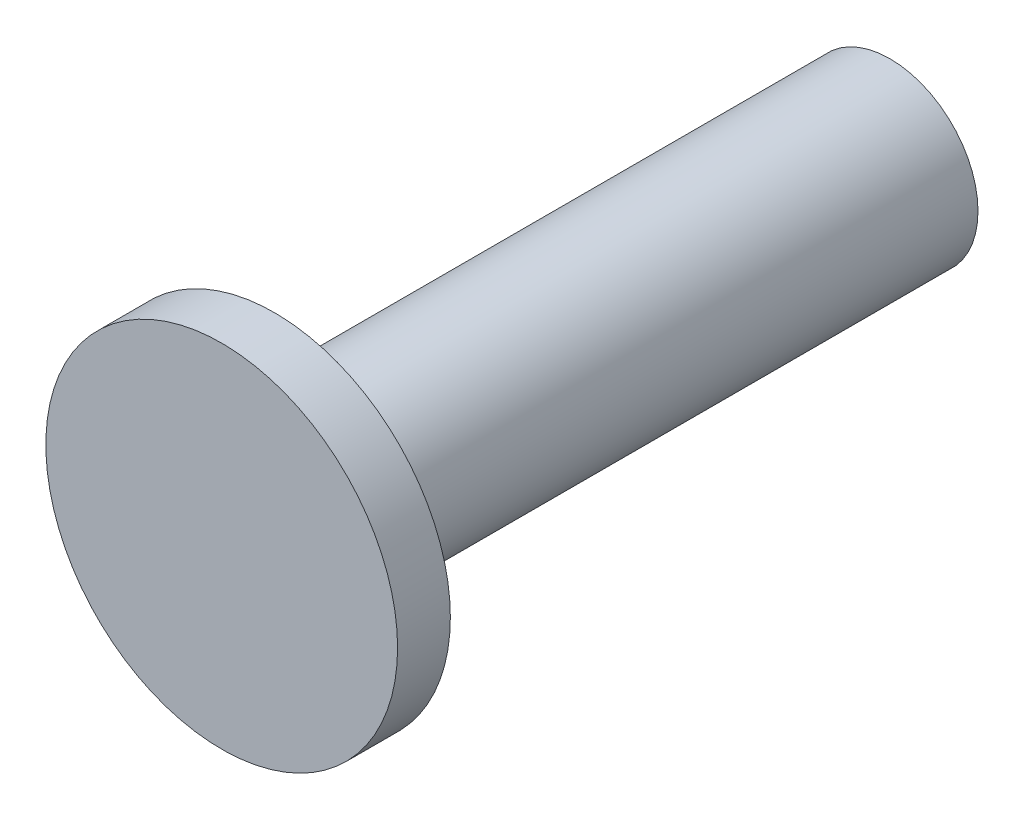
ISO-10303-21;
HEADER;
FILE_DESCRIPTION(('STEP AP214'),'2;1');
FILE_NAME('part.step','',(''),(''),'','','');
FILE_SCHEMA(('AUTOMOTIVE_DESIGN { 1 0 10303 214 1 1 1 1 }'));
ENDSEC;
DATA;
#1=APPLICATION_CONTEXT('core data for automotive mechanical design processes');
#2=APPLICATION_PROTOCOL_DEFINITION('international standard','automotive_design',2000,#1);
#3=PRODUCT_CONTEXT('',#1,'mechanical');
#4=PRODUCT('Part','Part','',(#3));
#5=PRODUCT_RELATED_PRODUCT_CATEGORY('part','',(#4));
#6=PRODUCT_DEFINITION_FORMATION('','',#4);
#7=PRODUCT_DEFINITION_CONTEXT('part definition',#1,'design');
#8=PRODUCT_DEFINITION('design','',#6,#7);
#9=PRODUCT_DEFINITION_SHAPE('','',#8);
#10=(LENGTH_UNIT() NAMED_UNIT(*) SI_UNIT(.MILLI.,.METRE.));
#11=(NAMED_UNIT(*) PLANE_ANGLE_UNIT() SI_UNIT($,.RADIAN.));
#12=(NAMED_UNIT(*) SI_UNIT($,.STERADIAN.) SOLID_ANGLE_UNIT());
#13=UNCERTAINTY_MEASURE_WITH_UNIT(LENGTH_MEASURE(1.E-05),#10,'distance_accuracy_value','');
#14=(GEOMETRIC_REPRESENTATION_CONTEXT(3) GLOBAL_UNCERTAINTY_ASSIGNED_CONTEXT((#13)) GLOBAL_UNIT_ASSIGNED_CONTEXT((#10,
#11,#12)) REPRESENTATION_CONTEXT('',''));
#15=CARTESIAN_POINT('',(0.,0.,0.));
#16=DIRECTION('',(0.,0.,1.));
#17=DIRECTION('',(1.,0.,0.));
#18=AXIS2_PLACEMENT_3D('',#15,#16,#17);
#19=CARTESIAN_POINT('',(0.,0.,35.));
#20=DIRECTION('',(0.,0.,-1.));
#21=DIRECTION('',(-1.,0.,0.));
#22=AXIS2_PLACEMENT_3D('',#19,#20,#21);
#23=CYLINDRICAL_SURFACE('',#22,5.);
#24=CARTESIAN_POINT('',(0.,0.,34.5));
#25=DIRECTION('',(0.,0.,1.));
#26=DIRECTION('',(1.,0.,0.));
#27=AXIS2_PLACEMENT_3D('',#24,#25,#26);
#28=CIRCLE('',#27,5.);
#29=CARTESIAN_POINT('',(5.,0.,34.5));
#30=VERTEX_POINT('',#29);
#31=EDGE_CURVE('E10',#30,#30,#28,.F.);
#32=ORIENTED_EDGE('',*,*,#31,.T.);
#33=EDGE_LOOP('',(#32));
#34=FACE_BOUND('',#33,.T.);
#35=CARTESIAN_POINT('',(0.,0.,0.));
#36=DIRECTION('',(0.,0.,1.));
#37=DIRECTION('',(1.,0.,0.));
#38=AXIS2_PLACEMENT_3D('',#35,#36,#37);
#39=CIRCLE('',#38,5.);
#40=CARTESIAN_POINT('',(5.,0.,0.));
#41=VERTEX_POINT('',#40);
#42=EDGE_CURVE('E41',#41,#41,#39,.T.);
#43=ORIENTED_EDGE('',*,*,#42,.T.);
#44=EDGE_LOOP('',(#43));
#45=FACE_BOUND('',#44,.T.);
#46=ADVANCED_FACE('F30',(#34,#45),#23,.T.);
#47=CARTESIAN_POINT('',(0.,0.,0.));
#48=DIRECTION('',(0.,0.,1.));
#49=DIRECTION('',(1.,0.,0.));
#50=AXIS2_PLACEMENT_3D('',#47,#48,#49);
#51=PLANE('',#50);
#52=ORIENTED_EDGE('',*,*,#42,.F.);
#53=EDGE_LOOP('',(#52));
#54=FACE_BOUND('',#53,.T.);
#55=ADVANCED_FACE('F59',(#54),#51,.F.);
#56=CARTESIAN_POINT('',(0.,0.,38.));
#57=DIRECTION('',(0.,0.,-1.));
#58=DIRECTION('',(-1.,0.,0.));
#59=AXIS2_PLACEMENT_3D('',#56,#57,#58);
#60=CYLINDRICAL_SURFACE('',#59,10.);
#61=CARTESIAN_POINT('',(0.,0.,38.));
#62=DIRECTION('',(0.,0.,1.));
#63=DIRECTION('',(1.,0.,0.));
#64=AXIS2_PLACEMENT_3D('',#61,#62,#63);
#65=CIRCLE('',#64,10.);
#66=CARTESIAN_POINT('',(10.,0.,38.));
#67=VERTEX_POINT('',#66);
#68=EDGE_CURVE('E45',#67,#67,#65,.T.);
#69=ORIENTED_EDGE('',*,*,#68,.F.);
#70=EDGE_LOOP('',(#69));
#71=FACE_BOUND('',#70,.T.);
#72=CARTESIAN_POINT('',(0.,0.,35.));
#73=DIRECTION('',(0.,0.,1.));
#74=DIRECTION('',(1.,0.,0.));
#75=AXIS2_PLACEMENT_3D('',#72,#73,#74);
#76=CIRCLE('',#75,10.);
#77=CARTESIAN_POINT('',(10.,0.,35.));
#78=VERTEX_POINT('',#77);
#79=EDGE_CURVE('E48',#78,#78,#76,.T.);
#80=ORIENTED_EDGE('',*,*,#79,.T.);
#81=EDGE_LOOP('',(#80));
#82=FACE_BOUND('',#81,.T.);
#83=ADVANCED_FACE('F56',(#71,#82),#60,.T.);
#84=CARTESIAN_POINT('',(0.,0.,38.));
#85=DIRECTION('',(0.,0.,1.));
#86=DIRECTION('',(1.,0.,0.));
#87=AXIS2_PLACEMENT_3D('',#84,#85,#86);
#88=PLANE('',#87);
#89=ORIENTED_EDGE('',*,*,#68,.T.);
#90=EDGE_LOOP('',(#89));
#91=FACE_BOUND('',#90,.T.);
#92=ADVANCED_FACE('F54',(#91),#88,.T.);
#93=CARTESIAN_POINT('',(0.,0.,35.));
#94=DIRECTION('',(0.,0.,1.));
#95=DIRECTION('',(1.,0.,0.));
#96=AXIS2_PLACEMENT_3D('',#93,#94,#95);
#97=PLANE('',#96);
#98=CARTESIAN_POINT('',(0.,0.,35.));
#99=DIRECTION('',(0.,0.,1.));
#100=DIRECTION('',(1.,0.,0.));
#101=AXIS2_PLACEMENT_3D('',#98,#99,#100);
#102=CIRCLE('',#101,5.5);
#103=CARTESIAN_POINT('',(5.5,0.,35.));
#104=VERTEX_POINT('',#103);
#105=EDGE_CURVE('E37',#104,#104,#102,.T.);
#106=ORIENTED_EDGE('',*,*,#105,.T.);
#107=EDGE_LOOP('',(#106));
#108=FACE_BOUND('',#107,.T.);
#109=ORIENTED_EDGE('',*,*,#79,.F.);
#110=EDGE_LOOP('',(#109));
#111=FACE_BOUND('',#110,.T.);
#112=ADVANCED_FACE('F63',(#108,#111),#97,.F.);
#113=CARTESIAN_POINT('',(0.,0.,34.5));
#114=DIRECTION('',(0.,0.,1.));
#115=DIRECTION('',(1.,0.,0.));
#116=AXIS2_PLACEMENT_3D('',#113,#114,#115);
#117=TOROIDAL_SURFACE('',#116,5.5,0.5);
#118=ORIENTED_EDGE('',*,*,#31,.F.);
#119=EDGE_LOOP('',(#118));
#120=FACE_BOUND('',#119,.T.);
#121=ORIENTED_EDGE('',*,*,#105,.F.);
#122=EDGE_LOOP('',(#121));
#123=FACE_BOUND('',#122,.T.);
#124=ADVANCED_FACE('F32',(#120,#123),#117,.F.);
#125=CLOSED_SHELL('',(#46,#55,#83,#92,#112,#124));
#126=MANIFOLD_SOLID_BREP('B2',#125);
#127=ADVANCED_BREP_SHAPE_REPRESENTATION('',(#18,#126),#14);
#128=SHAPE_DEFINITION_REPRESENTATION(#9,#127);
ENDSEC;
END-ISO-10303-21;
